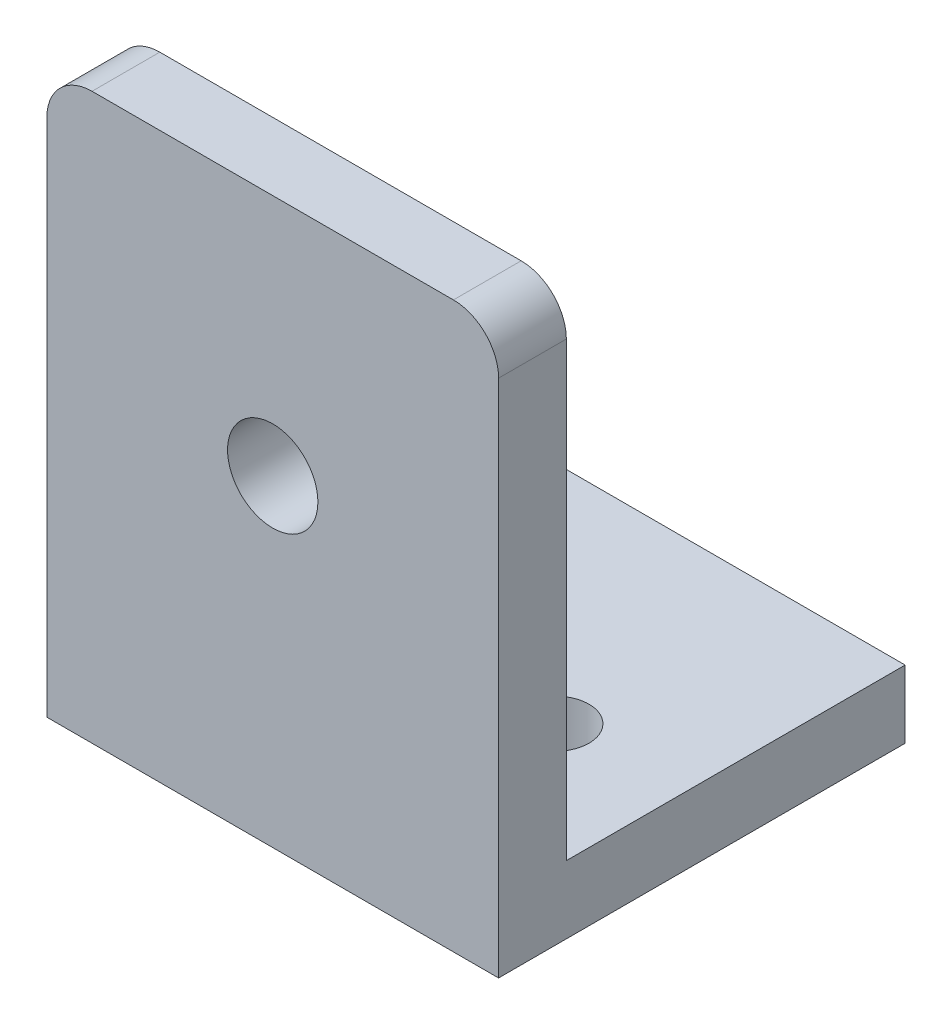
ISO-10303-21;
HEADER;
FILE_DESCRIPTION(('STEP AP214'),'2;1');
FILE_NAME('part.step','',(''),(''),'','','');
FILE_SCHEMA(('AUTOMOTIVE_DESIGN { 1 0 10303 214 1 1 1 1 }'));
ENDSEC;
DATA;
#1=APPLICATION_CONTEXT('core data for automotive mechanical design processes');
#2=APPLICATION_PROTOCOL_DEFINITION('international standard','automotive_design',2000,#1);
#3=PRODUCT_CONTEXT('',#1,'mechanical');
#4=PRODUCT('Part','Part','',(#3));
#5=PRODUCT_RELATED_PRODUCT_CATEGORY('part','',(#4));
#6=PRODUCT_DEFINITION_FORMATION('','',#4);
#7=PRODUCT_DEFINITION_CONTEXT('part definition',#1,'design');
#8=PRODUCT_DEFINITION('design','',#6,#7);
#9=PRODUCT_DEFINITION_SHAPE('','',#8);
#10=(LENGTH_UNIT() NAMED_UNIT(*) SI_UNIT(.MILLI.,.METRE.));
#11=(NAMED_UNIT(*) PLANE_ANGLE_UNIT() SI_UNIT($,.RADIAN.));
#12=(NAMED_UNIT(*) SI_UNIT($,.STERADIAN.) SOLID_ANGLE_UNIT());
#13=UNCERTAINTY_MEASURE_WITH_UNIT(LENGTH_MEASURE(1.E-05),#10,'distance_accuracy_value','');
#14=(GEOMETRIC_REPRESENTATION_CONTEXT(3) GLOBAL_UNCERTAINTY_ASSIGNED_CONTEXT((#13)) GLOBAL_UNIT_ASSIGNED_CONTEXT((#10,
#11,#12)) REPRESENTATION_CONTEXT('',''));
#15=CARTESIAN_POINT('',(0.,0.,0.));
#16=DIRECTION('',(0.,0.,1.));
#17=DIRECTION('',(1.,0.,0.));
#18=AXIS2_PLACEMENT_3D('',#15,#16,#17);
#19=CARTESIAN_POINT('',(20.,0.,-18.));
#20=DIRECTION('',(0.,1.,0.));
#21=DIRECTION('',(0.,0.,1.));
#22=AXIS2_PLACEMENT_3D('',#19,#20,#21);
#23=PLANE('',#22);
#24=CARTESIAN_POINT('',(14.5,0.,-8.));
#25=DIRECTION('',(0.,1.,0.));
#26=DIRECTION('',(0.,0.,1.));
#27=AXIS2_PLACEMENT_3D('',#24,#25,#26);
#28=CIRCLE('',#27,1.5);
#29=CARTESIAN_POINT('',(14.5,0.,-6.5));
#30=VERTEX_POINT('',#29);
#31=EDGE_CURVE('E184',#30,#30,#28,.T.);
#32=ORIENTED_EDGE('',*,*,#31,.T.);
#33=EDGE_LOOP('',(#32));
#34=FACE_BOUND('',#33,.T.);
#35=CARTESIAN_POINT('',(5.5,0.,-8.));
#36=DIRECTION('',(0.,1.,0.));
#37=DIRECTION('',(0.,0.,1.));
#38=AXIS2_PLACEMENT_3D('',#35,#36,#37);
#39=CIRCLE('',#38,1.5);
#40=CARTESIAN_POINT('',(5.5,0.,-6.5));
#41=VERTEX_POINT('',#40);
#42=EDGE_CURVE('E177',#41,#41,#39,.T.);
#43=ORIENTED_EDGE('',*,*,#42,.T.);
#44=EDGE_LOOP('',(#43));
#45=FACE_BOUND('',#44,.T.);
#46=DIRECTION('',(0.,0.,-1.));
#47=VECTOR('',#46,1.);
#48=CARTESIAN_POINT('',(0.,0.,-18.));
#49=LINE('',#48,#47);
#50=CARTESIAN_POINT('',(0.,0.,0.));
#51=VERTEX_POINT('',#50);
#52=CARTESIAN_POINT('',(0.,0.,-18.));
#53=VERTEX_POINT('',#52);
#54=EDGE_CURVE('E127',#51,#53,#49,.T.);
#55=ORIENTED_EDGE('',*,*,#54,.T.);
#56=DIRECTION('',(-1.,0.,0.));
#57=VECTOR('',#56,1.);
#58=CARTESIAN_POINT('',(20.,0.,-18.));
#59=LINE('',#58,#57);
#60=CARTESIAN_POINT('',(20.,0.,-18.));
#61=VERTEX_POINT('',#60);
#62=EDGE_CURVE('E108',#61,#53,#59,.T.);
#63=ORIENTED_EDGE('',*,*,#62,.F.);
#64=DIRECTION('',(0.,0.,-1.));
#65=VECTOR('',#64,1.);
#66=CARTESIAN_POINT('',(20.,0.,-18.));
#67=LINE('',#66,#65);
#68=CARTESIAN_POINT('',(20.,0.,0.));
#69=VERTEX_POINT('',#68);
#70=EDGE_CURVE('E115',#69,#61,#67,.T.);
#71=ORIENTED_EDGE('',*,*,#70,.F.);
#72=DIRECTION('',(-1.,0.,0.));
#73=VECTOR('',#72,1.);
#74=CARTESIAN_POINT('',(20.,0.,0.));
#75=LINE('',#74,#73);
#76=EDGE_CURVE('E167',#69,#51,#75,.T.);
#77=ORIENTED_EDGE('',*,*,#76,.T.);
#78=EDGE_LOOP('',(#55,#63,#71,#77));
#79=FACE_BOUND('',#78,.T.);
#80=ADVANCED_FACE('F35',(#34,#45,#79),#23,.F.);
#81=CARTESIAN_POINT('',(20.,3.,-18.));
#82=DIRECTION('',(0.,0.,1.));
#83=DIRECTION('',(0.,-1.,0.));
#84=AXIS2_PLACEMENT_3D('',#81,#82,#83);
#85=PLANE('',#84);
#86=DIRECTION('',(0.,1.,0.));
#87=VECTOR('',#86,1.);
#88=CARTESIAN_POINT('',(0.,3.,-18.));
#89=LINE('',#88,#87);
#90=CARTESIAN_POINT('',(0.,3.,-18.));
#91=VERTEX_POINT('',#90);
#92=EDGE_CURVE('E173',#53,#91,#89,.T.);
#93=ORIENTED_EDGE('',*,*,#92,.T.);
#94=DIRECTION('',(-1.,0.,0.));
#95=VECTOR('',#94,1.);
#96=CARTESIAN_POINT('',(20.,3.,-18.));
#97=LINE('',#96,#95);
#98=CARTESIAN_POINT('',(20.,3.,-18.));
#99=VERTEX_POINT('',#98);
#100=EDGE_CURVE('E111',#99,#91,#97,.T.);
#101=ORIENTED_EDGE('',*,*,#100,.F.);
#102=DIRECTION('',(0.,1.,0.));
#103=VECTOR('',#102,1.);
#104=CARTESIAN_POINT('',(20.,3.,-18.));
#105=LINE('',#104,#103);
#106=EDGE_CURVE('E104',#61,#99,#105,.T.);
#107=ORIENTED_EDGE('',*,*,#106,.F.);
#108=ORIENTED_EDGE('',*,*,#62,.T.);
#109=EDGE_LOOP('',(#93,#101,#107,#108));
#110=FACE_BOUND('',#109,.T.);
#111=ADVANCED_FACE('F106',(#110),#85,.F.);
#112=CARTESIAN_POINT('',(20.,3.,-3.));
#113=DIRECTION('',(0.,-1.,0.));
#114=DIRECTION('',(0.,0.,-1.));
#115=AXIS2_PLACEMENT_3D('',#112,#113,#114);
#116=PLANE('',#115);
#117=CARTESIAN_POINT('',(14.5,3.,-8.));
#118=DIRECTION('',(0.,1.,0.));
#119=DIRECTION('',(0.,0.,1.));
#120=AXIS2_PLACEMENT_3D('',#117,#118,#119);
#121=CIRCLE('',#120,1.5);
#122=CARTESIAN_POINT('',(14.5,3.,-6.5));
#123=VERTEX_POINT('',#122);
#124=EDGE_CURVE('E187',#123,#123,#121,.T.);
#125=ORIENTED_EDGE('',*,*,#124,.F.);
#126=EDGE_LOOP('',(#125));
#127=FACE_BOUND('',#126,.T.);
#128=CARTESIAN_POINT('',(5.5,3.,-8.));
#129=DIRECTION('',(0.,1.,0.));
#130=DIRECTION('',(0.,0.,1.));
#131=AXIS2_PLACEMENT_3D('',#128,#129,#130);
#132=CIRCLE('',#131,1.5);
#133=CARTESIAN_POINT('',(5.5,3.,-6.5));
#134=VERTEX_POINT('',#133);
#135=EDGE_CURVE('E181',#134,#134,#132,.T.);
#136=ORIENTED_EDGE('',*,*,#135,.F.);
#137=EDGE_LOOP('',(#136));
#138=FACE_BOUND('',#137,.T.);
#139=DIRECTION('',(0.,0.,1.));
#140=VECTOR('',#139,1.);
#141=CARTESIAN_POINT('',(0.,3.,-3.));
#142=LINE('',#141,#140);
#143=CARTESIAN_POINT('',(0.,3.,-3.));
#144=VERTEX_POINT('',#143);
#145=EDGE_CURVE('E163',#91,#144,#142,.T.);
#146=ORIENTED_EDGE('',*,*,#145,.T.);
#147=DIRECTION('',(-1.,0.,0.));
#148=VECTOR('',#147,1.);
#149=CARTESIAN_POINT('',(20.,3.,-3.));
#150=LINE('',#149,#148);
#151=CARTESIAN_POINT('',(20.,3.,-3.));
#152=VERTEX_POINT('',#151);
#153=EDGE_CURVE('E132',#152,#144,#150,.T.);
#154=ORIENTED_EDGE('',*,*,#153,.F.);
#155=DIRECTION('',(0.,0.,1.));
#156=VECTOR('',#155,1.);
#157=CARTESIAN_POINT('',(20.,3.,-3.));
#158=LINE('',#157,#156);
#159=EDGE_CURVE('E114',#99,#152,#158,.T.);
#160=ORIENTED_EDGE('',*,*,#159,.F.);
#161=ORIENTED_EDGE('',*,*,#100,.T.);
#162=EDGE_LOOP('',(#146,#154,#160,#161));
#163=FACE_BOUND('',#162,.T.);
#164=ADVANCED_FACE('F217',(#127,#138,#163),#116,.F.);
#165=CARTESIAN_POINT('',(20.,25.,-3.));
#166=DIRECTION('',(0.,0.,1.));
#167=DIRECTION('',(0.,-1.,0.));
#168=AXIS2_PLACEMENT_3D('',#165,#166,#167);
#169=PLANE('',#168);
#170=CARTESIAN_POINT('',(10.,14.25,-3.));
#171=DIRECTION('',(0.,0.,1.));
#172=DIRECTION('',(0.,-1.,0.));
#173=AXIS2_PLACEMENT_3D('',#170,#171,#172);
#174=CIRCLE('',#173,2.);
#175=CARTESIAN_POINT('',(10.,12.25,-3.));
#176=VERTEX_POINT('',#175);
#177=EDGE_CURVE('E190',#176,#176,#174,.T.);
#178=ORIENTED_EDGE('',*,*,#177,.T.);
#179=EDGE_LOOP('',(#178));
#180=FACE_BOUND('',#179,.T.);
#181=DIRECTION('',(0.,1.,0.));
#182=VECTOR('',#181,1.);
#183=CARTESIAN_POINT('',(0.,25.,-3.));
#184=LINE('',#183,#182);
#185=CARTESIAN_POINT('',(0.,23.,-3.));
#186=VERTEX_POINT('',#185);
#187=EDGE_CURVE('E148',#144,#186,#184,.T.);
#188=ORIENTED_EDGE('',*,*,#187,.T.);
#189=CARTESIAN_POINT('',(2.,23.,-3.));
#190=DIRECTION('',(0.,0.,1.));
#191=DIRECTION('',(0.,-1.,0.));
#192=AXIS2_PLACEMENT_3D('',#189,#190,#191);
#193=CIRCLE('',#192,2.);
#194=CARTESIAN_POINT('',(2.,25.,-3.));
#195=VERTEX_POINT('',#194);
#196=EDGE_CURVE('E43',#186,#195,#193,.F.);
#197=ORIENTED_EDGE('',*,*,#196,.T.);
#198=DIRECTION('',(-1.,0.,0.));
#199=VECTOR('',#198,1.);
#200=CARTESIAN_POINT('',(20.,25.,-3.));
#201=LINE('',#200,#199);
#202=CARTESIAN_POINT('',(18.,25.,-3.));
#203=VERTEX_POINT('',#202);
#204=EDGE_CURVE('E146',#203,#195,#201,.T.);
#205=ORIENTED_EDGE('',*,*,#204,.F.);
#206=CARTESIAN_POINT('',(18.,23.,-3.));
#207=DIRECTION('',(0.,0.,1.));
#208=DIRECTION('',(0.,-1.,0.));
#209=AXIS2_PLACEMENT_3D('',#206,#207,#208);
#210=CIRCLE('',#209,2.);
#211=CARTESIAN_POINT('',(20.,23.,-3.));
#212=VERTEX_POINT('',#211);
#213=EDGE_CURVE('E50',#203,#212,#210,.F.);
#214=ORIENTED_EDGE('',*,*,#213,.T.);
#215=DIRECTION('',(0.,1.,0.));
#216=VECTOR('',#215,1.);
#217=CARTESIAN_POINT('',(20.,25.,-3.));
#218=LINE('',#217,#216);
#219=EDGE_CURVE('E170',#152,#212,#218,.T.);
#220=ORIENTED_EDGE('',*,*,#219,.F.);
#221=ORIENTED_EDGE('',*,*,#153,.T.);
#222=EDGE_LOOP('',(#188,#197,#205,#214,#220,#221));
#223=FACE_BOUND('',#222,.T.);
#224=ADVANCED_FACE('F145',(#180,#223),#169,.F.);
#225=CARTESIAN_POINT('',(20.,25.,0.));
#226=DIRECTION('',(0.,-1.,0.));
#227=DIRECTION('',(0.,0.,-1.));
#228=AXIS2_PLACEMENT_3D('',#225,#226,#227);
#229=PLANE('',#228);
#230=ORIENTED_EDGE('',*,*,#204,.T.);
#231=DIRECTION('',(0.,0.,1.));
#232=VECTOR('',#231,1.);
#233=CARTESIAN_POINT('',(2.,25.,0.));
#234=LINE('',#233,#232);
#235=CARTESIAN_POINT('',(2.,25.,0.));
#236=VERTEX_POINT('',#235);
#237=EDGE_CURVE('E130',#195,#236,#234,.T.);
#238=ORIENTED_EDGE('',*,*,#237,.T.);
#239=DIRECTION('',(-1.,0.,0.));
#240=VECTOR('',#239,1.);
#241=CARTESIAN_POINT('',(20.,25.,0.));
#242=LINE('',#241,#240);
#243=CARTESIAN_POINT('',(18.,25.,0.));
#244=VERTEX_POINT('',#243);
#245=EDGE_CURVE('E156',#244,#236,#242,.T.);
#246=ORIENTED_EDGE('',*,*,#245,.F.);
#247=DIRECTION('',(0.,0.,1.));
#248=VECTOR('',#247,1.);
#249=CARTESIAN_POINT('',(18.,25.,0.));
#250=LINE('',#249,#248);
#251=EDGE_CURVE('E128',#244,#203,#250,.F.);
#252=ORIENTED_EDGE('',*,*,#251,.T.);
#253=EDGE_LOOP('',(#230,#238,#246,#252));
#254=FACE_BOUND('',#253,.T.);
#255=ADVANCED_FACE('F152',(#254),#229,.F.);
#256=CARTESIAN_POINT('',(20.,0.,0.));
#257=DIRECTION('',(0.,0.,-1.));
#258=DIRECTION('',(-1.,0.,0.));
#259=AXIS2_PLACEMENT_3D('',#256,#257,#258);
#260=PLANE('',#259);
#261=CARTESIAN_POINT('',(10.,14.25,0.));
#262=DIRECTION('',(0.,0.,1.));
#263=DIRECTION('',(1.,0.,0.));
#264=AXIS2_PLACEMENT_3D('',#261,#262,#263);
#265=CIRCLE('',#264,2.);
#266=CARTESIAN_POINT('',(12.,14.25,0.));
#267=VERTEX_POINT('',#266);
#268=EDGE_CURVE('E195',#267,#267,#265,.T.);
#269=ORIENTED_EDGE('',*,*,#268,.F.);
#270=EDGE_LOOP('',(#269));
#271=FACE_BOUND('',#270,.T.);
#272=ORIENTED_EDGE('',*,*,#245,.T.);
#273=CARTESIAN_POINT('',(2.,23.,0.));
#274=DIRECTION('',(0.,0.,-1.));
#275=DIRECTION('',(-1.,0.,0.));
#276=AXIS2_PLACEMENT_3D('',#273,#274,#275);
#277=CIRCLE('',#276,2.);
#278=CARTESIAN_POINT('',(0.,23.,0.));
#279=VERTEX_POINT('',#278);
#280=EDGE_CURVE('E140',#236,#279,#277,.F.);
#281=ORIENTED_EDGE('',*,*,#280,.T.);
#282=DIRECTION('',(0.,-1.,0.));
#283=VECTOR('',#282,1.);
#284=CARTESIAN_POINT('',(0.,0.,0.));
#285=LINE('',#284,#283);
#286=EDGE_CURVE('E124',#279,#51,#285,.T.);
#287=ORIENTED_EDGE('',*,*,#286,.T.);
#288=ORIENTED_EDGE('',*,*,#76,.F.);
#289=DIRECTION('',(0.,-1.,0.));
#290=VECTOR('',#289,1.);
#291=CARTESIAN_POINT('',(20.,0.,0.));
#292=LINE('',#291,#290);
#293=CARTESIAN_POINT('',(20.,23.,0.));
#294=VERTEX_POINT('',#293);
#295=EDGE_CURVE('E120',#294,#69,#292,.T.);
#296=ORIENTED_EDGE('',*,*,#295,.F.);
#297=CARTESIAN_POINT('',(18.,23.,0.));
#298=DIRECTION('',(0.,0.,-1.));
#299=DIRECTION('',(-1.,0.,0.));
#300=AXIS2_PLACEMENT_3D('',#297,#298,#299);
#301=CIRCLE('',#300,2.);
#302=EDGE_CURVE('E138',#294,#244,#301,.F.);
#303=ORIENTED_EDGE('',*,*,#302,.T.);
#304=EDGE_LOOP('',(#272,#281,#287,#288,#296,#303));
#305=FACE_BOUND('',#304,.T.);
#306=ADVANCED_FACE('F160',(#271,#305),#260,.F.);
#307=CARTESIAN_POINT('',(20.,0.,0.));
#308=DIRECTION('',(-1.,0.,0.));
#309=DIRECTION('',(0.,0.,1.));
#310=AXIS2_PLACEMENT_3D('',#307,#308,#309);
#311=PLANE('',#310);
#312=ORIENTED_EDGE('',*,*,#219,.T.);
#313=DIRECTION('',(0.,0.,1.));
#314=VECTOR('',#313,1.);
#315=CARTESIAN_POINT('',(20.,23.,0.));
#316=LINE('',#315,#314);
#317=EDGE_CURVE('E11',#212,#294,#316,.T.);
#318=ORIENTED_EDGE('',*,*,#317,.T.);
#319=ORIENTED_EDGE('',*,*,#295,.T.);
#320=ORIENTED_EDGE('',*,*,#70,.T.);
#321=ORIENTED_EDGE('',*,*,#106,.T.);
#322=ORIENTED_EDGE('',*,*,#159,.T.);
#323=EDGE_LOOP('',(#312,#318,#319,#320,#321,#322));
#324=FACE_BOUND('',#323,.T.);
#325=ADVANCED_FACE('F118',(#324),#311,.F.);
#326=CARTESIAN_POINT('',(0.,0.,0.));
#327=DIRECTION('',(-1.,0.,0.));
#328=DIRECTION('',(0.,0.,1.));
#329=AXIS2_PLACEMENT_3D('',#326,#327,#328);
#330=PLANE('',#329);
#331=ORIENTED_EDGE('',*,*,#286,.F.);
#332=DIRECTION('',(0.,0.,1.));
#333=VECTOR('',#332,1.);
#334=CARTESIAN_POINT('',(0.,23.,-3.));
#335=LINE('',#334,#333);
#336=EDGE_CURVE('E58',#279,#186,#335,.F.);
#337=ORIENTED_EDGE('',*,*,#336,.T.);
#338=ORIENTED_EDGE('',*,*,#187,.F.);
#339=ORIENTED_EDGE('',*,*,#145,.F.);
#340=ORIENTED_EDGE('',*,*,#92,.F.);
#341=ORIENTED_EDGE('',*,*,#54,.F.);
#342=EDGE_LOOP('',(#331,#337,#338,#339,#340,#341));
#343=FACE_BOUND('',#342,.T.);
#344=ADVANCED_FACE('F161',(#343),#330,.T.);
#345=CARTESIAN_POINT('',(5.5,0.,-8.));
#346=DIRECTION('',(0.,1.,0.));
#347=DIRECTION('',(0.,0.,1.));
#348=AXIS2_PLACEMENT_3D('',#345,#346,#347);
#349=CYLINDRICAL_SURFACE('',#348,1.5);
#350=ORIENTED_EDGE('',*,*,#42,.F.);
#351=EDGE_LOOP('',(#350));
#352=FACE_BOUND('',#351,.T.);
#353=ORIENTED_EDGE('',*,*,#135,.T.);
#354=EDGE_LOOP('',(#353));
#355=FACE_BOUND('',#354,.T.);
#356=ADVANCED_FACE('F228',(#352,#355),#349,.F.);
#357=CARTESIAN_POINT('',(14.5,0.,-8.));
#358=DIRECTION('',(0.,1.,0.));
#359=DIRECTION('',(0.,0.,1.));
#360=AXIS2_PLACEMENT_3D('',#357,#358,#359);
#361=CYLINDRICAL_SURFACE('',#360,1.5);
#362=ORIENTED_EDGE('',*,*,#31,.F.);
#363=EDGE_LOOP('',(#362));
#364=FACE_BOUND('',#363,.T.);
#365=ORIENTED_EDGE('',*,*,#124,.T.);
#366=EDGE_LOOP('',(#365));
#367=FACE_BOUND('',#366,.T.);
#368=ADVANCED_FACE('F222',(#364,#367),#361,.F.);
#369=CARTESIAN_POINT('',(2.,23.,0.));
#370=DIRECTION('',(0.,0.,-1.));
#371=DIRECTION('',(-1.,0.,0.));
#372=AXIS2_PLACEMENT_3D('',#369,#370,#371);
#373=CYLINDRICAL_SURFACE('',#372,2.);
#374=ORIENTED_EDGE('',*,*,#196,.F.);
#375=ORIENTED_EDGE('',*,*,#336,.F.);
#376=ORIENTED_EDGE('',*,*,#280,.F.);
#377=ORIENTED_EDGE('',*,*,#237,.F.);
#378=EDGE_LOOP('',(#374,#375,#376,#377));
#379=FACE_BOUND('',#378,.T.);
#380=ADVANCED_FACE('F158',(#379),#373,.T.);
#381=CARTESIAN_POINT('',(18.,23.,0.));
#382=DIRECTION('',(0.,0.,1.));
#383=DIRECTION('',(1.,0.,0.));
#384=AXIS2_PLACEMENT_3D('',#381,#382,#383);
#385=CYLINDRICAL_SURFACE('',#384,2.);
#386=ORIENTED_EDGE('',*,*,#213,.F.);
#387=ORIENTED_EDGE('',*,*,#251,.F.);
#388=ORIENTED_EDGE('',*,*,#302,.F.);
#389=ORIENTED_EDGE('',*,*,#317,.F.);
#390=EDGE_LOOP('',(#386,#387,#388,#389));
#391=FACE_BOUND('',#390,.T.);
#392=ADVANCED_FACE('F37',(#391),#385,.T.);
#393=CARTESIAN_POINT('',(10.,14.25,-18.));
#394=DIRECTION('',(0.,0.,1.));
#395=DIRECTION('',(1.,0.,0.));
#396=AXIS2_PLACEMENT_3D('',#393,#394,#395);
#397=CYLINDRICAL_SURFACE('',#396,2.);
#398=ORIENTED_EDGE('',*,*,#268,.T.);
#399=EDGE_LOOP('',(#398));
#400=FACE_BOUND('',#399,.T.);
#401=ORIENTED_EDGE('',*,*,#177,.F.);
#402=EDGE_LOOP('',(#401));
#403=FACE_BOUND('',#402,.T.);
#404=ADVANCED_FACE('F199',(#400,#403),#397,.F.);
#405=CLOSED_SHELL('',(#80,#111,#164,#224,#255,#306,#325,#344,#356,#368,#380,#392,#404));
#406=MANIFOLD_SOLID_BREP('B2',#405);
#407=ADVANCED_BREP_SHAPE_REPRESENTATION('',(#18,#406),#14);
#408=SHAPE_DEFINITION_REPRESENTATION(#9,#407);
ENDSEC;
END-ISO-10303-21;
